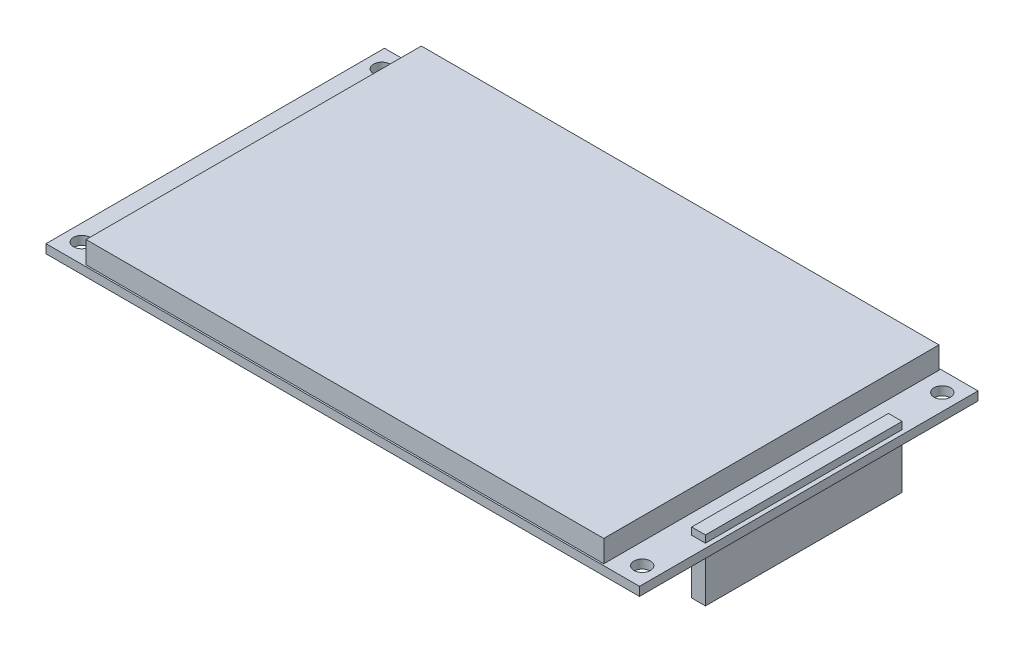
ISO-10303-21;
HEADER;
FILE_DESCRIPTION(('STEP AP214'),'2;1');
FILE_NAME('part.step','',(''),(''),'','','');
FILE_SCHEMA(('AUTOMOTIVE_DESIGN { 1 0 10303 214 1 1 1 1 }'));
ENDSEC;
DATA;
#1=APPLICATION_CONTEXT('core data for automotive mechanical design processes');
#2=APPLICATION_PROTOCOL_DEFINITION('international standard','automotive_design',2000,#1);
#3=PRODUCT_CONTEXT('',#1,'mechanical');
#4=PRODUCT('Part','Part','',(#3));
#5=PRODUCT_RELATED_PRODUCT_CATEGORY('part','',(#4));
#6=PRODUCT_DEFINITION_FORMATION('','',#4);
#7=PRODUCT_DEFINITION_CONTEXT('part definition',#1,'design');
#8=PRODUCT_DEFINITION('design','',#6,#7);
#9=PRODUCT_DEFINITION_SHAPE('','',#8);
#10=(LENGTH_UNIT() NAMED_UNIT(*) SI_UNIT(.MILLI.,.METRE.));
#11=(NAMED_UNIT(*) PLANE_ANGLE_UNIT() SI_UNIT($,.RADIAN.));
#12=(NAMED_UNIT(*) SI_UNIT($,.STERADIAN.) SOLID_ANGLE_UNIT());
#13=UNCERTAINTY_MEASURE_WITH_UNIT(LENGTH_MEASURE(1.E-05),#10,'distance_accuracy_value','');
#14=(GEOMETRIC_REPRESENTATION_CONTEXT(3) GLOBAL_UNCERTAINTY_ASSIGNED_CONTEXT((#13)) GLOBAL_UNIT_ASSIGNED_CONTEXT((#10,
#11,#12)) REPRESENTATION_CONTEXT('',''));
#15=CARTESIAN_POINT('',(0.,0.,0.));
#16=DIRECTION('',(0.,0.,1.));
#17=DIRECTION('',(1.,0.,0.));
#18=AXIS2_PLACEMENT_3D('',#15,#16,#17);
#19=CARTESIAN_POINT('',(0.,4.,0.));
#20=DIRECTION('',(1.,0.,0.));
#21=DIRECTION('',(0.,0.,-1.));
#22=AXIS2_PLACEMENT_3D('',#19,#20,#21);
#23=PLANE('',#22);
#24=DIRECTION('',(0.,0.,1.));
#25=VECTOR('',#24,1.);
#26=CARTESIAN_POINT('',(0.,0.,0.));
#27=LINE('',#26,#25);
#28=CARTESIAN_POINT('',(0.,0.,-61.));
#29=VERTEX_POINT('',#28);
#30=CARTESIAN_POINT('',(0.,0.,0.));
#31=VERTEX_POINT('',#30);
#32=EDGE_CURVE('E311',#29,#31,#27,.T.);
#33=ORIENTED_EDGE('',*,*,#32,.T.);
#34=DIRECTION('',(0.,-1.,0.));
#35=VECTOR('',#34,1.);
#36=CARTESIAN_POINT('',(0.,4.,0.));
#37=LINE('',#36,#35);
#38=CARTESIAN_POINT('',(0.,4.,0.));
#39=VERTEX_POINT('',#38);
#40=EDGE_CURVE('E341',#39,#31,#37,.T.);
#41=ORIENTED_EDGE('',*,*,#40,.F.);
#42=DIRECTION('',(0.,0.,1.));
#43=VECTOR('',#42,1.);
#44=CARTESIAN_POINT('',(0.,4.,0.));
#45=LINE('',#44,#43);
#46=CARTESIAN_POINT('',(0.,4.,-61.));
#47=VERTEX_POINT('',#46);
#48=EDGE_CURVE('E312',#47,#39,#45,.T.);
#49=ORIENTED_EDGE('',*,*,#48,.F.);
#50=DIRECTION('',(0.,-1.,0.));
#51=VECTOR('',#50,1.);
#52=CARTESIAN_POINT('',(0.,4.,-61.));
#53=LINE('',#52,#51);
#54=EDGE_CURVE('E322',#47,#29,#53,.T.);
#55=ORIENTED_EDGE('',*,*,#54,.T.);
#56=EDGE_LOOP('',(#33,#41,#49,#55));
#57=FACE_BOUND('',#56,.T.);
#58=ADVANCED_FACE('F43',(#57),#23,.F.);
#59=CARTESIAN_POINT('',(0.,4.,0.));
#60=DIRECTION('',(0.,0.,-1.));
#61=DIRECTION('',(-1.,0.,0.));
#62=AXIS2_PLACEMENT_3D('',#59,#60,#61);
#63=PLANE('',#62);
#64=DIRECTION('',(1.,0.,0.));
#65=VECTOR('',#64,1.);
#66=CARTESIAN_POINT('',(0.,0.,0.));
#67=LINE('',#66,#65);
#68=CARTESIAN_POINT('',(94.2,0.,0.));
#69=VERTEX_POINT('',#68);
#70=EDGE_CURVE('E325',#31,#69,#67,.T.);
#71=ORIENTED_EDGE('',*,*,#70,.T.);
#72=DIRECTION('',(0.,-1.,0.));
#73=VECTOR('',#72,1.);
#74=CARTESIAN_POINT('',(94.2,4.,0.));
#75=LINE('',#74,#73);
#76=CARTESIAN_POINT('',(94.2,4.,0.));
#77=VERTEX_POINT('',#76);
#78=EDGE_CURVE('E338',#77,#69,#75,.T.);
#79=ORIENTED_EDGE('',*,*,#78,.F.);
#80=DIRECTION('',(1.,0.,0.));
#81=VECTOR('',#80,1.);
#82=CARTESIAN_POINT('',(0.,4.,0.));
#83=LINE('',#82,#81);
#84=EDGE_CURVE('E315',#39,#77,#83,.T.);
#85=ORIENTED_EDGE('',*,*,#84,.F.);
#86=ORIENTED_EDGE('',*,*,#40,.T.);
#87=EDGE_LOOP('',(#71,#79,#85,#86));
#88=FACE_BOUND('',#87,.T.);
#89=ADVANCED_FACE('F381',(#88),#63,.F.);
#90=CARTESIAN_POINT('',(94.2,4.,0.));
#91=DIRECTION('',(-1.,0.,0.));
#92=DIRECTION('',(0.,0.,1.));
#93=AXIS2_PLACEMENT_3D('',#90,#91,#92);
#94=PLANE('',#93);
#95=DIRECTION('',(0.,0.,-1.));
#96=VECTOR('',#95,1.);
#97=CARTESIAN_POINT('',(94.2,0.,0.));
#98=LINE('',#97,#96);
#99=CARTESIAN_POINT('',(94.2,0.,-61.));
#100=VERTEX_POINT('',#99);
#101=EDGE_CURVE('E328',#69,#100,#98,.T.);
#102=ORIENTED_EDGE('',*,*,#101,.T.);
#103=DIRECTION('',(0.,-1.,0.));
#104=VECTOR('',#103,1.);
#105=CARTESIAN_POINT('',(94.2,4.,-61.));
#106=LINE('',#105,#104);
#107=CARTESIAN_POINT('',(94.2,4.,-61.));
#108=VERTEX_POINT('',#107);
#109=EDGE_CURVE('E335',#108,#100,#106,.T.);
#110=ORIENTED_EDGE('',*,*,#109,.F.);
#111=DIRECTION('',(0.,0.,-1.));
#112=VECTOR('',#111,1.);
#113=CARTESIAN_POINT('',(94.2,4.,0.));
#114=LINE('',#113,#112);
#115=EDGE_CURVE('E318',#77,#108,#114,.T.);
#116=ORIENTED_EDGE('',*,*,#115,.F.);
#117=ORIENTED_EDGE('',*,*,#78,.T.);
#118=EDGE_LOOP('',(#102,#110,#116,#117));
#119=FACE_BOUND('',#118,.T.);
#120=ADVANCED_FACE('F386',(#119),#94,.F.);
#121=CARTESIAN_POINT('',(0.,4.,-61.));
#122=DIRECTION('',(0.,0.,1.));
#123=DIRECTION('',(1.,0.,0.));
#124=AXIS2_PLACEMENT_3D('',#121,#122,#123);
#125=PLANE('',#124);
#126=DIRECTION('',(-1.,0.,0.));
#127=VECTOR('',#126,1.);
#128=CARTESIAN_POINT('',(0.,0.,-61.));
#129=LINE('',#128,#127);
#130=EDGE_CURVE('E316',#100,#29,#129,.T.);
#131=ORIENTED_EDGE('',*,*,#130,.T.);
#132=ORIENTED_EDGE('',*,*,#54,.F.);
#133=DIRECTION('',(-1.,0.,0.));
#134=VECTOR('',#133,1.);
#135=CARTESIAN_POINT('',(0.,4.,-61.));
#136=LINE('',#135,#134);
#137=EDGE_CURVE('E320',#108,#47,#136,.T.);
#138=ORIENTED_EDGE('',*,*,#137,.F.);
#139=ORIENTED_EDGE('',*,*,#109,.T.);
#140=EDGE_LOOP('',(#131,#132,#138,#139));
#141=FACE_BOUND('',#140,.T.);
#142=ADVANCED_FACE('F394',(#141),#125,.F.);
#143=CARTESIAN_POINT('',(0.,4.,0.));
#144=DIRECTION('',(0.,-1.,0.));
#145=DIRECTION('',(0.,0.,-1.));
#146=AXIS2_PLACEMENT_3D('',#143,#144,#145);
#147=PLANE('',#146);
#148=ORIENTED_EDGE('',*,*,#48,.T.);
#149=ORIENTED_EDGE('',*,*,#84,.T.);
#150=ORIENTED_EDGE('',*,*,#115,.T.);
#151=ORIENTED_EDGE('',*,*,#137,.T.);
#152=EDGE_LOOP('',(#148,#149,#150,#151));
#153=FACE_BOUND('',#152,.T.);
#154=ADVANCED_FACE('F401',(#153),#147,.F.);
#155=CARTESIAN_POINT('',(0.,0.,0.));
#156=DIRECTION('',(0.,1.,0.));
#157=DIRECTION('',(0.,0.,1.));
#158=AXIS2_PLACEMENT_3D('',#155,#156,#157);
#159=PLANE('',#158);
#160=CARTESIAN_POINT('',(-4.,0.,-3.2));
#161=DIRECTION('',(0.,1.,0.));
#162=DIRECTION('',(0.,0.,1.));
#163=AXIS2_PLACEMENT_3D('',#160,#161,#162);
#164=CIRCLE('',#163,1.5);
#165=CARTESIAN_POINT('',(-4.,0.,-1.69999999999999));
#166=VERTEX_POINT('',#165);
#167=EDGE_CURVE('E224',#166,#166,#164,.T.);
#168=ORIENTED_EDGE('',*,*,#167,.F.);
#169=EDGE_LOOP('',(#168));
#170=FACE_BOUND('',#169,.T.);
#171=CARTESIAN_POINT('',(98.,0.,-57.8));
#172=DIRECTION('',(0.,1.,0.));
#173=DIRECTION('',(0.,0.,1.));
#174=AXIS2_PLACEMENT_3D('',#171,#172,#173);
#175=CIRCLE('',#174,1.5);
#176=CARTESIAN_POINT('',(98.,0.,-56.3));
#177=VERTEX_POINT('',#176);
#178=EDGE_CURVE('E223',#177,#177,#175,.T.);
#179=ORIENTED_EDGE('',*,*,#178,.F.);
#180=EDGE_LOOP('',(#179));
#181=FACE_BOUND('',#180,.T.);
#182=CARTESIAN_POINT('',(98.,0.,-3.2));
#183=DIRECTION('',(0.,1.,0.));
#184=DIRECTION('',(0.,0.,1.));
#185=AXIS2_PLACEMENT_3D('',#182,#183,#184);
#186=CIRCLE('',#185,1.5);
#187=CARTESIAN_POINT('',(98.,0.,-1.7));
#188=VERTEX_POINT('',#187);
#189=EDGE_CURVE('E217',#188,#188,#186,.T.);
#190=ORIENTED_EDGE('',*,*,#189,.F.);
#191=EDGE_LOOP('',(#190));
#192=FACE_BOUND('',#191,.T.);
#193=CARTESIAN_POINT('',(-4.,0.,-57.8));
#194=DIRECTION('',(0.,1.,0.));
#195=DIRECTION('',(0.,0.,1.));
#196=AXIS2_PLACEMENT_3D('',#193,#194,#195);
#197=CIRCLE('',#196,1.5);
#198=CARTESIAN_POINT('',(-4.,0.,-56.3));
#199=VERTEX_POINT('',#198);
#200=EDGE_CURVE('E227',#199,#199,#197,.T.);
#201=ORIENTED_EDGE('',*,*,#200,.F.);
#202=EDGE_LOOP('',(#201));
#203=FACE_BOUND('',#202,.T.);
#204=DIRECTION('',(0.,0.,-1.));
#205=VECTOR('',#204,1.);
#206=CARTESIAN_POINT('',(100.2,0.,0.));
#207=LINE('',#206,#205);
#208=CARTESIAN_POINT('',(100.2,0.,-12.5));
#209=VERTEX_POINT('',#208);
#210=CARTESIAN_POINT('',(100.2,0.,-48.3));
#211=VERTEX_POINT('',#210);
#212=EDGE_CURVE('E67',#209,#211,#207,.T.);
#213=ORIENTED_EDGE('',*,*,#212,.F.);
#214=DIRECTION('',(1.,0.,0.));
#215=VECTOR('',#214,1.);
#216=CARTESIAN_POINT('',(0.,0.,-12.5));
#217=LINE('',#216,#215);
#218=CARTESIAN_POINT('',(97.7,0.,-12.5));
#219=VERTEX_POINT('',#218);
#220=EDGE_CURVE('E278',#219,#209,#217,.T.);
#221=ORIENTED_EDGE('',*,*,#220,.F.);
#222=DIRECTION('',(0.,0.,1.));
#223=VECTOR('',#222,1.);
#224=CARTESIAN_POINT('',(97.7,0.,0.));
#225=LINE('',#224,#223);
#226=CARTESIAN_POINT('',(97.7,0.,-48.3));
#227=VERTEX_POINT('',#226);
#228=EDGE_CURVE('E275',#227,#219,#225,.T.);
#229=ORIENTED_EDGE('',*,*,#228,.F.);
#230=DIRECTION('',(-1.,0.,0.));
#231=VECTOR('',#230,1.);
#232=CARTESIAN_POINT('',(0.,0.,-48.3));
#233=LINE('',#232,#231);
#234=EDGE_CURVE('E261',#211,#227,#233,.T.);
#235=ORIENTED_EDGE('',*,*,#234,.F.);
#236=EDGE_LOOP('',(#213,#221,#229,#235));
#237=FACE_BOUND('',#236,.T.);
#238=DIRECTION('',(0.,0.,-1.));
#239=VECTOR('',#238,1.);
#240=CARTESIAN_POINT('',(-7.,0.,-61.3));
#241=LINE('',#240,#239);
#242=CARTESIAN_POINT('',(-7.,0.,0.300000000000002));
#243=VERTEX_POINT('',#242);
#244=CARTESIAN_POINT('',(-7.,0.,-61.3));
#245=VERTEX_POINT('',#244);
#246=EDGE_CURVE('E281',#243,#245,#241,.T.);
#247=ORIENTED_EDGE('',*,*,#246,.F.);
#248=DIRECTION('',(-1.,0.,0.));
#249=VECTOR('',#248,1.);
#250=CARTESIAN_POINT('',(-7.,0.,0.300000000000002));
#251=LINE('',#250,#249);
#252=CARTESIAN_POINT('',(101.,0.,0.300000000000002));
#253=VERTEX_POINT('',#252);
#254=EDGE_CURVE('E286',#253,#243,#251,.T.);
#255=ORIENTED_EDGE('',*,*,#254,.F.);
#256=DIRECTION('',(0.,0.,1.));
#257=VECTOR('',#256,1.);
#258=CARTESIAN_POINT('',(101.,0.,-61.3));
#259=LINE('',#258,#257);
#260=CARTESIAN_POINT('',(101.,0.,-61.3));
#261=VERTEX_POINT('',#260);
#262=EDGE_CURVE('E297',#261,#253,#259,.T.);
#263=ORIENTED_EDGE('',*,*,#262,.F.);
#264=DIRECTION('',(1.,0.,0.));
#265=VECTOR('',#264,1.);
#266=CARTESIAN_POINT('',(-7.,0.,-61.3));
#267=LINE('',#266,#265);
#268=EDGE_CURVE('E295',#245,#261,#267,.T.);
#269=ORIENTED_EDGE('',*,*,#268,.F.);
#270=EDGE_LOOP('',(#247,#255,#263,#269));
#271=FACE_BOUND('',#270,.T.);
#272=ORIENTED_EDGE('',*,*,#32,.F.);
#273=ORIENTED_EDGE('',*,*,#130,.F.);
#274=ORIENTED_EDGE('',*,*,#101,.F.);
#275=ORIENTED_EDGE('',*,*,#70,.F.);
#276=EDGE_LOOP('',(#272,#273,#274,#275));
#277=FACE_BOUND('',#276,.T.);
#278=ADVANCED_FACE('F392',(#170,#181,#192,#203,#237,#271,#277),#159,.T.);
#279=CARTESIAN_POINT('',(-7.,-1.6,-61.3));
#280=DIRECTION('',(1.,0.,0.));
#281=DIRECTION('',(0.,0.,-1.));
#282=AXIS2_PLACEMENT_3D('',#279,#280,#281);
#283=PLANE('',#282);
#284=ORIENTED_EDGE('',*,*,#246,.T.);
#285=DIRECTION('',(0.,1.,0.));
#286=VECTOR('',#285,1.);
#287=CARTESIAN_POINT('',(-7.,-1.6,-61.3));
#288=LINE('',#287,#286);
#289=CARTESIAN_POINT('',(-7.,-1.6,-61.3));
#290=VERTEX_POINT('',#289);
#291=EDGE_CURVE('E308',#290,#245,#288,.T.);
#292=ORIENTED_EDGE('',*,*,#291,.F.);
#293=DIRECTION('',(0.,0.,-1.));
#294=VECTOR('',#293,1.);
#295=CARTESIAN_POINT('',(-7.,-1.6,-61.3));
#296=LINE('',#295,#294);
#297=CARTESIAN_POINT('',(-7.,-1.6,0.300000000000002));
#298=VERTEX_POINT('',#297);
#299=EDGE_CURVE('E282',#298,#290,#296,.T.);
#300=ORIENTED_EDGE('',*,*,#299,.F.);
#301=DIRECTION('',(0.,1.,0.));
#302=VECTOR('',#301,1.);
#303=CARTESIAN_POINT('',(-7.,-1.6,0.300000000000002));
#304=LINE('',#303,#302);
#305=EDGE_CURVE('E292',#298,#243,#304,.T.);
#306=ORIENTED_EDGE('',*,*,#305,.T.);
#307=EDGE_LOOP('',(#284,#292,#300,#306));
#308=FACE_BOUND('',#307,.T.);
#309=ADVANCED_FACE('F408',(#308),#283,.F.);
#310=CARTESIAN_POINT('',(-7.,-1.6,-61.3));
#311=DIRECTION('',(0.,0.,1.));
#312=DIRECTION('',(1.,0.,0.));
#313=AXIS2_PLACEMENT_3D('',#310,#311,#312);
#314=PLANE('',#313);
#315=ORIENTED_EDGE('',*,*,#268,.T.);
#316=DIRECTION('',(0.,1.,0.));
#317=VECTOR('',#316,1.);
#318=CARTESIAN_POINT('',(101.,-1.6,-61.3));
#319=LINE('',#318,#317);
#320=CARTESIAN_POINT('',(101.,-1.6,-61.3));
#321=VERTEX_POINT('',#320);
#322=EDGE_CURVE('E305',#321,#261,#319,.T.);
#323=ORIENTED_EDGE('',*,*,#322,.F.);
#324=DIRECTION('',(1.,0.,0.));
#325=VECTOR('',#324,1.);
#326=CARTESIAN_POINT('',(-7.,-1.6,-61.3));
#327=LINE('',#326,#325);
#328=EDGE_CURVE('E285',#290,#321,#327,.T.);
#329=ORIENTED_EDGE('',*,*,#328,.F.);
#330=ORIENTED_EDGE('',*,*,#291,.T.);
#331=EDGE_LOOP('',(#315,#323,#329,#330));
#332=FACE_BOUND('',#331,.T.);
#333=ADVANCED_FACE('F435',(#332),#314,.F.);
#334=CARTESIAN_POINT('',(101.,-1.6,-61.3));
#335=DIRECTION('',(-1.,0.,0.));
#336=DIRECTION('',(0.,0.,1.));
#337=AXIS2_PLACEMENT_3D('',#334,#335,#336);
#338=PLANE('',#337);
#339=ORIENTED_EDGE('',*,*,#262,.T.);
#340=DIRECTION('',(0.,1.,0.));
#341=VECTOR('',#340,1.);
#342=CARTESIAN_POINT('',(101.,-1.6,0.300000000000002));
#343=LINE('',#342,#341);
#344=CARTESIAN_POINT('',(101.,-1.6,0.300000000000002));
#345=VERTEX_POINT('',#344);
#346=EDGE_CURVE('E302',#345,#253,#343,.T.);
#347=ORIENTED_EDGE('',*,*,#346,.F.);
#348=DIRECTION('',(0.,0.,1.));
#349=VECTOR('',#348,1.);
#350=CARTESIAN_POINT('',(101.,-1.6,-61.3));
#351=LINE('',#350,#349);
#352=EDGE_CURVE('E288',#321,#345,#351,.T.);
#353=ORIENTED_EDGE('',*,*,#352,.F.);
#354=ORIENTED_EDGE('',*,*,#322,.T.);
#355=EDGE_LOOP('',(#339,#347,#353,#354));
#356=FACE_BOUND('',#355,.T.);
#357=ADVANCED_FACE('F446',(#356),#338,.F.);
#358=CARTESIAN_POINT('',(-7.,-1.6,0.300000000000002));
#359=DIRECTION('',(0.,0.,-1.));
#360=DIRECTION('',(-1.,0.,0.));
#361=AXIS2_PLACEMENT_3D('',#358,#359,#360);
#362=PLANE('',#361);
#363=ORIENTED_EDGE('',*,*,#254,.T.);
#364=ORIENTED_EDGE('',*,*,#305,.F.);
#365=DIRECTION('',(-1.,0.,0.));
#366=VECTOR('',#365,1.);
#367=CARTESIAN_POINT('',(-7.,-1.6,0.300000000000002));
#368=LINE('',#367,#366);
#369=EDGE_CURVE('E290',#345,#298,#368,.T.);
#370=ORIENTED_EDGE('',*,*,#369,.F.);
#371=ORIENTED_EDGE('',*,*,#346,.T.);
#372=EDGE_LOOP('',(#363,#364,#370,#371));
#373=FACE_BOUND('',#372,.T.);
#374=ADVANCED_FACE('F456',(#373),#362,.F.);
#375=CARTESIAN_POINT('',(0.,-1.6,0.));
#376=DIRECTION('',(0.,1.,0.));
#377=DIRECTION('',(0.,0.,1.));
#378=AXIS2_PLACEMENT_3D('',#375,#376,#377);
#379=PLANE('',#378);
#380=DIRECTION('',(1.,0.,0.));
#381=VECTOR('',#380,1.);
#382=CARTESIAN_POINT('',(21.,-1.6,-21.2));
#383=LINE('',#382,#381);
#384=CARTESIAN_POINT('',(21.,-1.6,-21.2));
#385=VERTEX_POINT('',#384);
#386=CARTESIAN_POINT('',(48.,-1.6,-21.2));
#387=VERTEX_POINT('',#386);
#388=EDGE_CURVE('E206',#385,#387,#383,.T.);
#389=ORIENTED_EDGE('',*,*,#388,.F.);
#390=DIRECTION('',(0.,0.,1.));
#391=VECTOR('',#390,1.);
#392=CARTESIAN_POINT('',(21.,-1.6,-21.2));
#393=LINE('',#392,#391);
#394=CARTESIAN_POINT('',(21.,-1.6,-4.2));
#395=VERTEX_POINT('',#394);
#396=EDGE_CURVE('E212',#385,#395,#393,.T.);
#397=ORIENTED_EDGE('',*,*,#396,.T.);
#398=DIRECTION('',(1.,0.,0.));
#399=VECTOR('',#398,1.);
#400=CARTESIAN_POINT('',(21.,-1.6,-4.2));
#401=LINE('',#400,#399);
#402=CARTESIAN_POINT('',(48.,-1.6,-4.2));
#403=VERTEX_POINT('',#402);
#404=EDGE_CURVE('E188',#395,#403,#401,.T.);
#405=ORIENTED_EDGE('',*,*,#404,.T.);
#406=DIRECTION('',(0.,0.,1.));
#407=VECTOR('',#406,1.);
#408=CARTESIAN_POINT('',(48.,-1.6,-21.2));
#409=LINE('',#408,#407);
#410=EDGE_CURVE('E59',#387,#403,#409,.T.);
#411=ORIENTED_EDGE('',*,*,#410,.F.);
#412=EDGE_LOOP('',(#389,#397,#405,#411));
#413=FACE_BOUND('',#412,.T.);
#414=CARTESIAN_POINT('',(-4.,-1.6,-3.2));
#415=DIRECTION('',(0.,1.,0.));
#416=DIRECTION('',(0.,0.,1.));
#417=AXIS2_PLACEMENT_3D('',#414,#415,#416);
#418=CIRCLE('',#417,1.5);
#419=CARTESIAN_POINT('',(-4.,-1.6,-1.69999999999999));
#420=VERTEX_POINT('',#419);
#421=EDGE_CURVE('E46',#420,#420,#418,.T.);
#422=ORIENTED_EDGE('',*,*,#421,.T.);
#423=EDGE_LOOP('',(#422));
#424=FACE_BOUND('',#423,.T.);
#425=CARTESIAN_POINT('',(98.,-1.6,-57.8));
#426=DIRECTION('',(0.,1.,0.));
#427=DIRECTION('',(0.,0.,1.));
#428=AXIS2_PLACEMENT_3D('',#425,#426,#427);
#429=CIRCLE('',#428,1.5);
#430=CARTESIAN_POINT('',(98.,-1.6,-56.3));
#431=VERTEX_POINT('',#430);
#432=EDGE_CURVE('E356',#431,#431,#429,.T.);
#433=ORIENTED_EDGE('',*,*,#432,.T.);
#434=EDGE_LOOP('',(#433));
#435=FACE_BOUND('',#434,.T.);
#436=CARTESIAN_POINT('',(98.,-1.6,-3.2));
#437=DIRECTION('',(0.,1.,0.));
#438=DIRECTION('',(0.,0.,1.));
#439=AXIS2_PLACEMENT_3D('',#436,#437,#438);
#440=CIRCLE('',#439,1.5);
#441=CARTESIAN_POINT('',(98.,-1.6,-1.7));
#442=VERTEX_POINT('',#441);
#443=EDGE_CURVE('E354',#442,#442,#440,.T.);
#444=ORIENTED_EDGE('',*,*,#443,.T.);
#445=EDGE_LOOP('',(#444));
#446=FACE_BOUND('',#445,.T.);
#447=CARTESIAN_POINT('',(-4.,-1.6,-57.8));
#448=DIRECTION('',(0.,1.,0.));
#449=DIRECTION('',(0.,0.,1.));
#450=AXIS2_PLACEMENT_3D('',#447,#448,#449);
#451=CIRCLE('',#450,1.5);
#452=CARTESIAN_POINT('',(-4.,-1.6,-56.3));
#453=VERTEX_POINT('',#452);
#454=EDGE_CURVE('E232',#453,#453,#451,.T.);
#455=ORIENTED_EDGE('',*,*,#454,.T.);
#456=EDGE_LOOP('',(#455));
#457=FACE_BOUND('',#456,.T.);
#458=DIRECTION('',(1.,0.,0.));
#459=VECTOR('',#458,1.);
#460=CARTESIAN_POINT('',(0.,-1.6,-12.5));
#461=LINE('',#460,#459);
#462=CARTESIAN_POINT('',(97.7,-1.6,-12.5));
#463=VERTEX_POINT('',#462);
#464=CARTESIAN_POINT('',(100.2,-1.6,-12.5));
#465=VERTEX_POINT('',#464);
#466=EDGE_CURVE('E51',#463,#465,#461,.T.);
#467=ORIENTED_EDGE('',*,*,#466,.T.);
#468=DIRECTION('',(0.,0.,-1.));
#469=VECTOR('',#468,1.);
#470=CARTESIAN_POINT('',(100.2,-1.6,0.));
#471=LINE('',#470,#469);
#472=CARTESIAN_POINT('',(100.2,-1.6,-48.3));
#473=VERTEX_POINT('',#472);
#474=EDGE_CURVE('E11',#465,#473,#471,.T.);
#475=ORIENTED_EDGE('',*,*,#474,.T.);
#476=DIRECTION('',(-1.,0.,0.));
#477=VECTOR('',#476,1.);
#478=CARTESIAN_POINT('',(0.,-1.6,-48.3));
#479=LINE('',#478,#477);
#480=CARTESIAN_POINT('',(97.7,-1.6,-48.3));
#481=VERTEX_POINT('',#480);
#482=EDGE_CURVE('E344',#473,#481,#479,.T.);
#483=ORIENTED_EDGE('',*,*,#482,.T.);
#484=DIRECTION('',(0.,0.,1.));
#485=VECTOR('',#484,1.);
#486=CARTESIAN_POINT('',(97.7,-1.6,0.));
#487=LINE('',#486,#485);
#488=EDGE_CURVE('E347',#481,#463,#487,.T.);
#489=ORIENTED_EDGE('',*,*,#488,.T.);
#490=EDGE_LOOP('',(#467,#475,#483,#489));
#491=FACE_BOUND('',#490,.T.);
#492=ORIENTED_EDGE('',*,*,#299,.T.);
#493=ORIENTED_EDGE('',*,*,#328,.T.);
#494=ORIENTED_EDGE('',*,*,#352,.T.);
#495=ORIENTED_EDGE('',*,*,#369,.T.);
#496=EDGE_LOOP('',(#492,#493,#494,#495));
#497=FACE_BOUND('',#496,.T.);
#498=ADVANCED_FACE('F363',(#413,#424,#435,#446,#457,#491,#497),#379,.F.);
#499=CARTESIAN_POINT('',(0.,-9.9,0.));
#500=DIRECTION('',(0.,-1.,0.));
#501=DIRECTION('',(0.,0.,-1.));
#502=AXIS2_PLACEMENT_3D('',#499,#500,#501);
#503=PLANE('',#502);
#504=DIRECTION('',(0.,0.,-1.));
#505=VECTOR('',#504,1.);
#506=CARTESIAN_POINT('',(100.2,-9.9,-48.3));
#507=LINE('',#506,#505);
#508=CARTESIAN_POINT('',(100.2,-9.9,-12.5));
#509=VERTEX_POINT('',#508);
#510=CARTESIAN_POINT('',(100.2,-9.9,-48.3));
#511=VERTEX_POINT('',#510);
#512=EDGE_CURVE('E245',#509,#511,#507,.T.);
#513=ORIENTED_EDGE('',*,*,#512,.F.);
#514=DIRECTION('',(1.,0.,0.));
#515=VECTOR('',#514,1.);
#516=CARTESIAN_POINT('',(100.2,-9.9,-12.5));
#517=LINE('',#516,#515);
#518=CARTESIAN_POINT('',(97.7,-9.9,-12.5));
#519=VERTEX_POINT('',#518);
#520=EDGE_CURVE('E254',#519,#509,#517,.T.);
#521=ORIENTED_EDGE('',*,*,#520,.F.);
#522=DIRECTION('',(0.,0.,1.));
#523=VECTOR('',#522,1.);
#524=CARTESIAN_POINT('',(97.7,-9.9,-48.3));
#525=LINE('',#524,#523);
#526=CARTESIAN_POINT('',(97.7,-9.9,-48.3));
#527=VERTEX_POINT('',#526);
#528=EDGE_CURVE('E251',#527,#519,#525,.T.);
#529=ORIENTED_EDGE('',*,*,#528,.F.);
#530=DIRECTION('',(-1.,0.,0.));
#531=VECTOR('',#530,1.);
#532=CARTESIAN_POINT('',(100.2,-9.9,-48.3));
#533=LINE('',#532,#531);
#534=EDGE_CURVE('E248',#511,#527,#533,.T.);
#535=ORIENTED_EDGE('',*,*,#534,.F.);
#536=EDGE_LOOP('',(#513,#521,#529,#535));
#537=FACE_BOUND('',#536,.T.);
#538=ADVANCED_FACE('F475',(#537),#503,.T.);
#539=CARTESIAN_POINT('',(100.2,-9.9,-48.3));
#540=DIRECTION('',(0.,0.,-1.));
#541=DIRECTION('',(-1.,0.,0.));
#542=AXIS2_PLACEMENT_3D('',#539,#540,#541);
#543=PLANE('',#542);
#544=ORIENTED_EDGE('',*,*,#482,.F.);
#545=DIRECTION('',(0.,1.,0.));
#546=VECTOR('',#545,1.);
#547=CARTESIAN_POINT('',(100.2,-9.9,-48.3));
#548=LINE('',#547,#546);
#549=EDGE_CURVE('E270',#511,#473,#548,.T.);
#550=ORIENTED_EDGE('',*,*,#549,.F.);
#551=ORIENTED_EDGE('',*,*,#534,.T.);
#552=DIRECTION('',(0.,1.,0.));
#553=VECTOR('',#552,1.);
#554=CARTESIAN_POINT('',(97.7,-9.9,-48.3));
#555=LINE('',#554,#553);
#556=EDGE_CURVE('E267',#527,#481,#555,.T.);
#557=ORIENTED_EDGE('',*,*,#556,.T.);
#558=EDGE_LOOP('',(#544,#550,#551,#557));
#559=FACE_BOUND('',#558,.T.);
#560=ADVANCED_FACE('F480',(#559),#543,.T.);
#561=CARTESIAN_POINT('',(97.7,-9.9,-48.3));
#562=DIRECTION('',(-1.,0.,0.));
#563=DIRECTION('',(0.,0.,1.));
#564=AXIS2_PLACEMENT_3D('',#561,#562,#563);
#565=PLANE('',#564);
#566=ORIENTED_EDGE('',*,*,#488,.F.);
#567=ORIENTED_EDGE('',*,*,#556,.F.);
#568=ORIENTED_EDGE('',*,*,#528,.T.);
#569=DIRECTION('',(0.,1.,0.));
#570=VECTOR('',#569,1.);
#571=CARTESIAN_POINT('',(97.7,-9.9,-12.5));
#572=LINE('',#571,#570);
#573=EDGE_CURVE('E263',#519,#463,#572,.T.);
#574=ORIENTED_EDGE('',*,*,#573,.T.);
#575=EDGE_LOOP('',(#566,#567,#568,#574));
#576=FACE_BOUND('',#575,.T.);
#577=ADVANCED_FACE('F491',(#576),#565,.T.);
#578=CARTESIAN_POINT('',(100.2,-9.9,-12.5));
#579=DIRECTION('',(0.,0.,1.));
#580=DIRECTION('',(1.,0.,0.));
#581=AXIS2_PLACEMENT_3D('',#578,#579,#580);
#582=PLANE('',#581);
#583=ORIENTED_EDGE('',*,*,#466,.F.);
#584=ORIENTED_EDGE('',*,*,#573,.F.);
#585=ORIENTED_EDGE('',*,*,#520,.T.);
#586=DIRECTION('',(0.,1.,0.));
#587=VECTOR('',#586,1.);
#588=CARTESIAN_POINT('',(100.2,-9.9,-12.5));
#589=LINE('',#588,#587);
#590=EDGE_CURVE('E258',#509,#465,#589,.T.);
#591=ORIENTED_EDGE('',*,*,#590,.T.);
#592=EDGE_LOOP('',(#583,#584,#585,#591));
#593=FACE_BOUND('',#592,.T.);
#594=ADVANCED_FACE('F503',(#593),#582,.T.);
#595=CARTESIAN_POINT('',(100.2,-9.9,-48.3));
#596=DIRECTION('',(1.,0.,0.));
#597=DIRECTION('',(0.,0.,-1.));
#598=AXIS2_PLACEMENT_3D('',#595,#596,#597);
#599=PLANE('',#598);
#600=ORIENTED_EDGE('',*,*,#474,.F.);
#601=ORIENTED_EDGE('',*,*,#590,.F.);
#602=ORIENTED_EDGE('',*,*,#512,.T.);
#603=ORIENTED_EDGE('',*,*,#549,.T.);
#604=EDGE_LOOP('',(#600,#601,#602,#603));
#605=FACE_BOUND('',#604,.T.);
#606=ADVANCED_FACE('F515',(#605),#599,.T.);
#607=CARTESIAN_POINT('',(100.2,1.3,-12.5));
#608=VERTEX_POINT('',#607);
#609=EDGE_CURVE('E262',#209,#608,#589,.T.);
#610=ORIENTED_EDGE('',*,*,#609,.F.);
#611=ORIENTED_EDGE('',*,*,#212,.T.);
#612=CARTESIAN_POINT('',(100.2,1.3,-48.3));
#613=VERTEX_POINT('',#612);
#614=EDGE_CURVE('E257',#211,#613,#548,.T.);
#615=ORIENTED_EDGE('',*,*,#614,.T.);
#616=DIRECTION('',(0.,0.,-1.));
#617=VECTOR('',#616,1.);
#618=CARTESIAN_POINT('',(100.2,1.3,-48.3));
#619=LINE('',#618,#617);
#620=EDGE_CURVE('E233',#608,#613,#619,.T.);
#621=ORIENTED_EDGE('',*,*,#620,.F.);
#622=EDGE_LOOP('',(#610,#611,#615,#621));
#623=FACE_BOUND('',#622,.T.);
#624=ADVANCED_FACE('F527',(#623),#599,.T.);
#625=CARTESIAN_POINT('',(97.7,1.3,-12.5));
#626=VERTEX_POINT('',#625);
#627=EDGE_CURVE('E266',#219,#626,#572,.T.);
#628=ORIENTED_EDGE('',*,*,#627,.F.);
#629=ORIENTED_EDGE('',*,*,#220,.T.);
#630=ORIENTED_EDGE('',*,*,#609,.T.);
#631=DIRECTION('',(1.,0.,0.));
#632=VECTOR('',#631,1.);
#633=CARTESIAN_POINT('',(100.2,1.3,-12.5));
#634=LINE('',#633,#632);
#635=EDGE_CURVE('E242',#626,#608,#634,.T.);
#636=ORIENTED_EDGE('',*,*,#635,.F.);
#637=EDGE_LOOP('',(#628,#629,#630,#636));
#638=FACE_BOUND('',#637,.T.);
#639=ADVANCED_FACE('F518',(#638),#582,.T.);
#640=CARTESIAN_POINT('',(97.7,1.3,-48.3));
#641=VERTEX_POINT('',#640);
#642=EDGE_CURVE('E269',#227,#641,#555,.T.);
#643=ORIENTED_EDGE('',*,*,#642,.F.);
#644=ORIENTED_EDGE('',*,*,#228,.T.);
#645=ORIENTED_EDGE('',*,*,#627,.T.);
#646=DIRECTION('',(0.,0.,1.));
#647=VECTOR('',#646,1.);
#648=CARTESIAN_POINT('',(97.7,1.3,-48.3));
#649=LINE('',#648,#647);
#650=EDGE_CURVE('E239',#641,#626,#649,.T.);
#651=ORIENTED_EDGE('',*,*,#650,.F.);
#652=EDGE_LOOP('',(#643,#644,#645,#651));
#653=FACE_BOUND('',#652,.T.);
#654=ADVANCED_FACE('F506',(#653),#565,.T.);
#655=ORIENTED_EDGE('',*,*,#614,.F.);
#656=ORIENTED_EDGE('',*,*,#234,.T.);
#657=ORIENTED_EDGE('',*,*,#642,.T.);
#658=DIRECTION('',(-1.,0.,0.));
#659=VECTOR('',#658,1.);
#660=CARTESIAN_POINT('',(100.2,1.3,-48.3));
#661=LINE('',#660,#659);
#662=EDGE_CURVE('E236',#613,#641,#661,.T.);
#663=ORIENTED_EDGE('',*,*,#662,.F.);
#664=EDGE_LOOP('',(#655,#656,#657,#663));
#665=FACE_BOUND('',#664,.T.);
#666=ADVANCED_FACE('F494',(#665),#543,.T.);
#667=CARTESIAN_POINT('',(0.,1.3,0.));
#668=DIRECTION('',(0.,-1.,0.));
#669=DIRECTION('',(0.,0.,-1.));
#670=AXIS2_PLACEMENT_3D('',#667,#668,#669);
#671=PLANE('',#670);
#672=ORIENTED_EDGE('',*,*,#620,.T.);
#673=ORIENTED_EDGE('',*,*,#662,.T.);
#674=ORIENTED_EDGE('',*,*,#650,.T.);
#675=ORIENTED_EDGE('',*,*,#635,.T.);
#676=EDGE_LOOP('',(#672,#673,#674,#675));
#677=FACE_BOUND('',#676,.T.);
#678=ADVANCED_FACE('F565',(#677),#671,.F.);
#679=CARTESIAN_POINT('',(-4.,-2.,-57.8));
#680=DIRECTION('',(0.,1.,0.));
#681=DIRECTION('',(0.,0.,1.));
#682=AXIS2_PLACEMENT_3D('',#679,#680,#681);
#683=CYLINDRICAL_SURFACE('',#682,1.5);
#684=ORIENTED_EDGE('',*,*,#200,.T.);
#685=EDGE_LOOP('',(#684));
#686=FACE_BOUND('',#685,.T.);
#687=ORIENTED_EDGE('',*,*,#454,.F.);
#688=EDGE_LOOP('',(#687));
#689=FACE_BOUND('',#688,.T.);
#690=ADVANCED_FACE('F575',(#686,#689),#683,.F.);
#691=CARTESIAN_POINT('',(98.,-2.,-3.2));
#692=DIRECTION('',(0.,1.,0.));
#693=DIRECTION('',(0.,0.,1.));
#694=AXIS2_PLACEMENT_3D('',#691,#692,#693);
#695=CYLINDRICAL_SURFACE('',#694,1.5);
#696=ORIENTED_EDGE('',*,*,#189,.T.);
#697=EDGE_LOOP('',(#696));
#698=FACE_BOUND('',#697,.T.);
#699=ORIENTED_EDGE('',*,*,#443,.F.);
#700=EDGE_LOOP('',(#699));
#701=FACE_BOUND('',#700,.T.);
#702=ADVANCED_FACE('F376',(#698,#701),#695,.F.);
#703=CARTESIAN_POINT('',(98.,-2.,-57.8));
#704=DIRECTION('',(0.,1.,0.));
#705=DIRECTION('',(0.,0.,1.));
#706=AXIS2_PLACEMENT_3D('',#703,#704,#705);
#707=CYLINDRICAL_SURFACE('',#706,1.5);
#708=ORIENTED_EDGE('',*,*,#178,.T.);
#709=EDGE_LOOP('',(#708));
#710=FACE_BOUND('',#709,.T.);
#711=ORIENTED_EDGE('',*,*,#432,.F.);
#712=EDGE_LOOP('',(#711));
#713=FACE_BOUND('',#712,.T.);
#714=ADVANCED_FACE('F367',(#710,#713),#707,.F.);
#715=CARTESIAN_POINT('',(-4.,-2.,-3.2));
#716=DIRECTION('',(0.,1.,0.));
#717=DIRECTION('',(0.,0.,1.));
#718=AXIS2_PLACEMENT_3D('',#715,#716,#717);
#719=CYLINDRICAL_SURFACE('',#718,1.5);
#720=ORIENTED_EDGE('',*,*,#167,.T.);
#721=EDGE_LOOP('',(#720));
#722=FACE_BOUND('',#721,.T.);
#723=ORIENTED_EDGE('',*,*,#421,.F.);
#724=EDGE_LOOP('',(#723));
#725=FACE_BOUND('',#724,.T.);
#726=ADVANCED_FACE('F365',(#722,#725),#719,.F.);
#727=CARTESIAN_POINT('',(21.,-4.6,-21.2));
#728=DIRECTION('',(-1.,0.,0.));
#729=DIRECTION('',(0.,0.,1.));
#730=AXIS2_PLACEMENT_3D('',#727,#728,#729);
#731=PLANE('',#730);
#732=ORIENTED_EDGE('',*,*,#396,.F.);
#733=DIRECTION('',(0.,1.,0.));
#734=VECTOR('',#733,1.);
#735=CARTESIAN_POINT('',(21.,-4.6,-21.2));
#736=LINE('',#735,#734);
#737=CARTESIAN_POINT('',(21.,-4.6,-21.2));
#738=VERTEX_POINT('',#737);
#739=EDGE_CURVE('E204',#738,#385,#736,.T.);
#740=ORIENTED_EDGE('',*,*,#739,.F.);
#741=DIRECTION('',(0.,0.,1.));
#742=VECTOR('',#741,1.);
#743=CARTESIAN_POINT('',(21.,-4.6,-21.2));
#744=LINE('',#743,#742);
#745=CARTESIAN_POINT('',(21.,-4.6,-4.2));
#746=VERTEX_POINT('',#745);
#747=EDGE_CURVE('E199',#738,#746,#744,.T.);
#748=ORIENTED_EDGE('',*,*,#747,.T.);
#749=DIRECTION('',(0.,1.,0.));
#750=VECTOR('',#749,1.);
#751=CARTESIAN_POINT('',(21.,-4.6,-4.2));
#752=LINE('',#751,#750);
#753=EDGE_CURVE('E183',#746,#395,#752,.T.);
#754=ORIENTED_EDGE('',*,*,#753,.T.);
#755=EDGE_LOOP('',(#732,#740,#748,#754));
#756=FACE_BOUND('',#755,.T.);
#757=ADVANCED_FACE('F203',(#756),#731,.T.);
#758=CARTESIAN_POINT('',(21.,-4.6,-21.2));
#759=DIRECTION('',(0.,0.,1.));
#760=DIRECTION('',(1.,0.,0.));
#761=AXIS2_PLACEMENT_3D('',#758,#759,#760);
#762=PLANE('',#761);
#763=ORIENTED_EDGE('',*,*,#388,.T.);
#764=DIRECTION('',(0.,1.,0.));
#765=VECTOR('',#764,1.);
#766=CARTESIAN_POINT('',(48.,-4.6,-21.2));
#767=LINE('',#766,#765);
#768=CARTESIAN_POINT('',(48.,-4.6,-21.2));
#769=VERTEX_POINT('',#768);
#770=EDGE_CURVE('E218',#769,#387,#767,.T.);
#771=ORIENTED_EDGE('',*,*,#770,.F.);
#772=DIRECTION('',(1.,0.,0.));
#773=VECTOR('',#772,1.);
#774=CARTESIAN_POINT('',(21.,-4.6,-21.2));
#775=LINE('',#774,#773);
#776=EDGE_CURVE('E194',#738,#769,#775,.T.);
#777=ORIENTED_EDGE('',*,*,#776,.F.);
#778=ORIENTED_EDGE('',*,*,#739,.T.);
#779=EDGE_LOOP('',(#763,#771,#777,#778));
#780=FACE_BOUND('',#779,.T.);
#781=ADVANCED_FACE('F374',(#780),#762,.F.);
#782=CARTESIAN_POINT('',(48.,-4.6,-21.2));
#783=DIRECTION('',(-1.,0.,0.));
#784=DIRECTION('',(0.,0.,1.));
#785=AXIS2_PLACEMENT_3D('',#782,#783,#784);
#786=PLANE('',#785);
#787=ORIENTED_EDGE('',*,*,#410,.T.);
#788=DIRECTION('',(0.,1.,0.));
#789=VECTOR('',#788,1.);
#790=CARTESIAN_POINT('',(48.,-4.6,-4.2));
#791=LINE('',#790,#789);
#792=CARTESIAN_POINT('',(48.,-4.6,-4.2));
#793=VERTEX_POINT('',#792);
#794=EDGE_CURVE('E193',#793,#403,#791,.T.);
#795=ORIENTED_EDGE('',*,*,#794,.F.);
#796=DIRECTION('',(0.,0.,1.));
#797=VECTOR('',#796,1.);
#798=CARTESIAN_POINT('',(48.,-4.6,-21.2));
#799=LINE('',#798,#797);
#800=EDGE_CURVE('E201',#769,#793,#799,.T.);
#801=ORIENTED_EDGE('',*,*,#800,.F.);
#802=ORIENTED_EDGE('',*,*,#770,.T.);
#803=EDGE_LOOP('',(#787,#795,#801,#802));
#804=FACE_BOUND('',#803,.T.);
#805=ADVANCED_FACE('F638',(#804),#786,.F.);
#806=CARTESIAN_POINT('',(21.,-4.6,-4.2));
#807=DIRECTION('',(0.,0.,1.));
#808=DIRECTION('',(1.,0.,0.));
#809=AXIS2_PLACEMENT_3D('',#806,#807,#808);
#810=PLANE('',#809);
#811=ORIENTED_EDGE('',*,*,#404,.F.);
#812=ORIENTED_EDGE('',*,*,#753,.F.);
#813=DIRECTION('',(1.,0.,0.));
#814=VECTOR('',#813,1.);
#815=CARTESIAN_POINT('',(21.,-4.6,-4.2));
#816=LINE('',#815,#814);
#817=EDGE_CURVE('E186',#746,#793,#816,.T.);
#818=ORIENTED_EDGE('',*,*,#817,.T.);
#819=ORIENTED_EDGE('',*,*,#794,.T.);
#820=EDGE_LOOP('',(#811,#812,#818,#819));
#821=FACE_BOUND('',#820,.T.);
#822=ADVANCED_FACE('F185',(#821),#810,.T.);
#823=CARTESIAN_POINT('',(0.,-4.6,0.));
#824=DIRECTION('',(0.,1.,0.));
#825=DIRECTION('',(0.,0.,1.));
#826=AXIS2_PLACEMENT_3D('',#823,#824,#825);
#827=PLANE('',#826);
#828=ORIENTED_EDGE('',*,*,#747,.F.);
#829=ORIENTED_EDGE('',*,*,#776,.T.);
#830=ORIENTED_EDGE('',*,*,#800,.T.);
#831=ORIENTED_EDGE('',*,*,#817,.F.);
#832=EDGE_LOOP('',(#828,#829,#830,#831));
#833=FACE_BOUND('',#832,.T.);
#834=ADVANCED_FACE('F198',(#833),#827,.F.);
#835=CLOSED_SHELL('',(#58,#89,#120,#142,#154,#278,#309,#333,#357,#374,#498,#538,#560,#577,#594,
#606,#624,#639,#654,#666,#678,#690,#702,#714,#726,#757,#781,#805,#822,#834));
#836=MANIFOLD_SOLID_BREP('B2',#835);
#837=ADVANCED_BREP_SHAPE_REPRESENTATION('',(#18,#836),#14);
#838=SHAPE_DEFINITION_REPRESENTATION(#9,#837);
ENDSEC;
END-ISO-10303-21;
